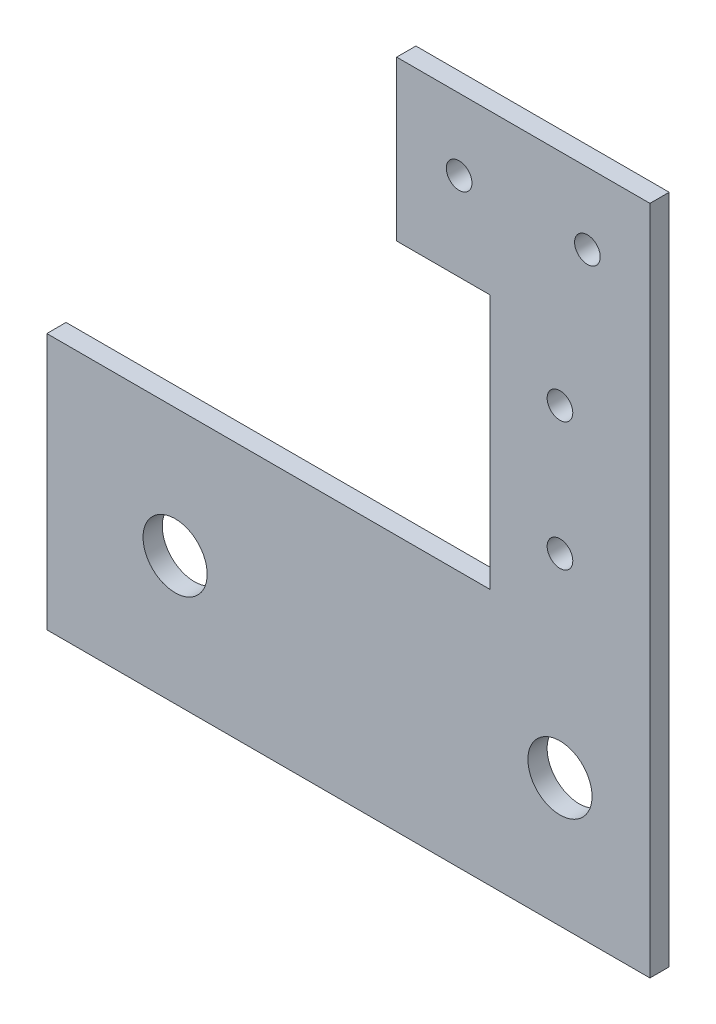
ISO-10303-21;
HEADER;
FILE_DESCRIPTION(('STEP AP214'),'2;1');
FILE_NAME('part.step','',(''),(''),'','','');
FILE_SCHEMA(('AUTOMOTIVE_DESIGN { 1 0 10303 214 1 1 1 1 }'));
ENDSEC;
DATA;
#1=APPLICATION_CONTEXT('core data for automotive mechanical design processes');
#2=APPLICATION_PROTOCOL_DEFINITION('international standard','automotive_design',2000,#1);
#3=PRODUCT_CONTEXT('',#1,'mechanical');
#4=PRODUCT('Part','Part','',(#3));
#5=PRODUCT_RELATED_PRODUCT_CATEGORY('part','',(#4));
#6=PRODUCT_DEFINITION_FORMATION('','',#4);
#7=PRODUCT_DEFINITION_CONTEXT('part definition',#1,'design');
#8=PRODUCT_DEFINITION('design','',#6,#7);
#9=PRODUCT_DEFINITION_SHAPE('','',#8);
#10=(LENGTH_UNIT() NAMED_UNIT(*) SI_UNIT(.MILLI.,.METRE.));
#11=(NAMED_UNIT(*) PLANE_ANGLE_UNIT() SI_UNIT($,.RADIAN.));
#12=(NAMED_UNIT(*) SI_UNIT($,.STERADIAN.) SOLID_ANGLE_UNIT());
#13=UNCERTAINTY_MEASURE_WITH_UNIT(LENGTH_MEASURE(1.E-05),#10,'distance_accuracy_value','');
#14=(GEOMETRIC_REPRESENTATION_CONTEXT(3) GLOBAL_UNCERTAINTY_ASSIGNED_CONTEXT((#13)) GLOBAL_UNIT_ASSIGNED_CONTEXT((#10,
#11,#12)) REPRESENTATION_CONTEXT('',''));
#15=CARTESIAN_POINT('',(0.,0.,0.));
#16=DIRECTION('',(0.,0.,1.));
#17=DIRECTION('',(1.,0.,0.));
#18=AXIS2_PLACEMENT_3D('',#15,#16,#17);
#19=CARTESIAN_POINT('',(-12.4753394630552,0.,1.5));
#20=DIRECTION('',(1.,0.,0.));
#21=DIRECTION('',(0.,0.,-1.));
#22=AXIS2_PLACEMENT_3D('',#19,#20,#21);
#23=PLANE('',#22);
#24=DIRECTION('',(0.,-1.,0.));
#25=VECTOR('',#24,1.);
#26=CARTESIAN_POINT('',(-12.4753394630552,0.,0.));
#27=LINE('',#26,#25);
#28=CARTESIAN_POINT('',(-12.4753394630552,19.6462038788269,0.));
#29=VERTEX_POINT('',#28);
#30=CARTESIAN_POINT('',(-12.4753394630552,-0.233517886677646,0.));
#31=VERTEX_POINT('',#30);
#32=EDGE_CURVE('E151',#29,#31,#27,.T.);
#33=ORIENTED_EDGE('',*,*,#32,.T.);
#34=DIRECTION('',(0.,0.,-1.));
#35=VECTOR('',#34,1.);
#36=CARTESIAN_POINT('',(-12.4753394630552,-0.233517886677646,1.5));
#37=LINE('',#36,#35);
#38=CARTESIAN_POINT('',(-12.4753394630552,-0.233517886677646,1.5));
#39=VERTEX_POINT('',#38);
#40=EDGE_CURVE('E11',#39,#31,#37,.T.);
#41=ORIENTED_EDGE('',*,*,#40,.F.);
#42=DIRECTION('',(0.,-1.,0.));
#43=VECTOR('',#42,1.);
#44=CARTESIAN_POINT('',(-12.4753394630552,0.,1.5));
#45=LINE('',#44,#43);
#46=CARTESIAN_POINT('',(-12.4753394630552,19.6462038788269,1.5));
#47=VERTEX_POINT('',#46);
#48=EDGE_CURVE('E195',#47,#39,#45,.T.);
#49=ORIENTED_EDGE('',*,*,#48,.F.);
#50=DIRECTION('',(0.,0.,-1.));
#51=VECTOR('',#50,1.);
#52=CARTESIAN_POINT('',(-12.4753394630552,19.6462038788269,1.5));
#53=LINE('',#52,#51);
#54=EDGE_CURVE('E129',#47,#29,#53,.T.);
#55=ORIENTED_EDGE('',*,*,#54,.T.);
#56=EDGE_LOOP('',(#33,#41,#49,#55));
#57=FACE_BOUND('',#56,.T.);
#58=ADVANCED_FACE('F36',(#57),#23,.F.);
#59=CARTESIAN_POINT('',(0.,-0.233517886677646,1.5));
#60=DIRECTION('',(0.,-1.,0.));
#61=DIRECTION('',(0.,0.,-1.));
#62=AXIS2_PLACEMENT_3D('',#59,#60,#61);
#63=PLANE('',#62);
#64=DIRECTION('',(-1.,0.,0.));
#65=VECTOR('',#64,1.);
#66=CARTESIAN_POINT('',(0.,-0.233517886677646,0.));
#67=LINE('',#66,#65);
#68=CARTESIAN_POINT('',(-47.0136947847413,-0.233517886677646,0.));
#69=VERTEX_POINT('',#68);
#70=EDGE_CURVE('E154',#31,#69,#67,.T.);
#71=ORIENTED_EDGE('',*,*,#70,.T.);
#72=DIRECTION('',(0.,0.,-1.));
#73=VECTOR('',#72,1.);
#74=CARTESIAN_POINT('',(-47.0136947847413,-0.233517886677646,1.5));
#75=LINE('',#74,#73);
#76=CARTESIAN_POINT('',(-47.0136947847413,-0.233517886677646,1.5));
#77=VERTEX_POINT('',#76);
#78=EDGE_CURVE('E45',#77,#69,#75,.T.);
#79=ORIENTED_EDGE('',*,*,#78,.F.);
#80=DIRECTION('',(-1.,0.,0.));
#81=VECTOR('',#80,1.);
#82=CARTESIAN_POINT('',(0.,-0.233517886677646,1.5));
#83=LINE('',#82,#81);
#84=EDGE_CURVE('E96',#39,#77,#83,.T.);
#85=ORIENTED_EDGE('',*,*,#84,.F.);
#86=ORIENTED_EDGE('',*,*,#40,.T.);
#87=EDGE_LOOP('',(#71,#79,#85,#86));
#88=FACE_BOUND('',#87,.T.);
#89=ADVANCED_FACE('F246',(#88),#63,.F.);
#90=CARTESIAN_POINT('',(-47.0136947847413,0.,1.5));
#91=DIRECTION('',(1.,0.,0.));
#92=DIRECTION('',(0.,1.,0.));
#93=AXIS2_PLACEMENT_3D('',#90,#91,#92);
#94=PLANE('',#93);
#95=DIRECTION('',(0.,-1.,0.));
#96=VECTOR('',#95,1.);
#97=CARTESIAN_POINT('',(-47.0136947847413,0.,0.));
#98=LINE('',#97,#96);
#99=CARTESIAN_POINT('',(-47.0136947847413,-20.2335178866776,0.));
#100=VERTEX_POINT('',#99);
#101=EDGE_CURVE('E156',#69,#100,#98,.T.);
#102=ORIENTED_EDGE('',*,*,#101,.T.);
#103=DIRECTION('',(0.,0.,-1.));
#104=VECTOR('',#103,1.);
#105=CARTESIAN_POINT('',(-47.0136947847413,-20.2335178866776,1.5));
#106=LINE('',#105,#104);
#107=CARTESIAN_POINT('',(-47.0136947847413,-20.2335178866776,1.5));
#108=VERTEX_POINT('',#107);
#109=EDGE_CURVE('E174',#108,#100,#106,.T.);
#110=ORIENTED_EDGE('',*,*,#109,.F.);
#111=DIRECTION('',(0.,-1.,0.));
#112=VECTOR('',#111,1.);
#113=CARTESIAN_POINT('',(-47.0136947847413,0.,1.5));
#114=LINE('',#113,#112);
#115=EDGE_CURVE('E181',#77,#108,#114,.T.);
#116=ORIENTED_EDGE('',*,*,#115,.F.);
#117=ORIENTED_EDGE('',*,*,#78,.T.);
#118=EDGE_LOOP('',(#102,#110,#116,#117));
#119=FACE_BOUND('',#118,.T.);
#120=ADVANCED_FACE('F179',(#119),#94,.F.);
#121=CARTESIAN_POINT('',(0.,-20.2335178866776,1.5));
#122=DIRECTION('',(0.,-1.,0.));
#123=DIRECTION('',(1.,0.,0.));
#124=AXIS2_PLACEMENT_3D('',#121,#122,#123);
#125=PLANE('',#124);
#126=DIRECTION('',(-1.,0.,0.));
#127=VECTOR('',#126,1.);
#128=CARTESIAN_POINT('',(0.,-20.2335178866776,0.));
#129=LINE('',#128,#127);
#130=CARTESIAN_POINT('',(0.,-20.2335178866776,0.));
#131=VERTEX_POINT('',#130);
#132=EDGE_CURVE('E159',#131,#100,#129,.T.);
#133=ORIENTED_EDGE('',*,*,#132,.F.);
#134=DIRECTION('',(0.,0.,-1.));
#135=VECTOR('',#134,1.);
#136=CARTESIAN_POINT('',(0.,-20.2335178866776,1.5));
#137=LINE('',#136,#135);
#138=CARTESIAN_POINT('',(0.,-20.2335178866776,1.5));
#139=VERTEX_POINT('',#138);
#140=EDGE_CURVE('E172',#139,#131,#137,.T.);
#141=ORIENTED_EDGE('',*,*,#140,.F.);
#142=DIRECTION('',(-1.,0.,0.));
#143=VECTOR('',#142,1.);
#144=CARTESIAN_POINT('',(0.,-20.2335178866776,1.5));
#145=LINE('',#144,#143);
#146=EDGE_CURVE('E190',#139,#108,#145,.T.);
#147=ORIENTED_EDGE('',*,*,#146,.T.);
#148=ORIENTED_EDGE('',*,*,#109,.T.);
#149=EDGE_LOOP('',(#133,#141,#147,#148));
#150=FACE_BOUND('',#149,.T.);
#151=ADVANCED_FACE('F188',(#150),#125,.T.);
#152=CARTESIAN_POINT('',(0.,0.,1.5));
#153=DIRECTION('',(1.,0.,0.));
#154=DIRECTION('',(0.,1.,0.));
#155=AXIS2_PLACEMENT_3D('',#152,#153,#154);
#156=PLANE('',#155);
#157=DIRECTION('',(0.,-1.,0.));
#158=VECTOR('',#157,1.);
#159=CARTESIAN_POINT('',(0.,0.,0.));
#160=LINE('',#159,#158);
#161=CARTESIAN_POINT('',(0.,32.0615509697022,0.));
#162=VERTEX_POINT('',#161);
#163=EDGE_CURVE('E162',#162,#131,#160,.T.);
#164=ORIENTED_EDGE('',*,*,#163,.F.);
#165=DIRECTION('',(0.,0.,-1.));
#166=VECTOR('',#165,1.);
#167=CARTESIAN_POINT('',(0.,32.0615509697022,1.5));
#168=LINE('',#167,#166);
#169=CARTESIAN_POINT('',(0.,32.0615509697022,1.5));
#170=VERTEX_POINT('',#169);
#171=EDGE_CURVE('E124',#170,#162,#168,.T.);
#172=ORIENTED_EDGE('',*,*,#171,.F.);
#173=DIRECTION('',(0.,-1.,0.));
#174=VECTOR('',#173,1.);
#175=CARTESIAN_POINT('',(0.,0.,1.5));
#176=LINE('',#175,#174);
#177=EDGE_CURVE('E117',#170,#139,#176,.T.);
#178=ORIENTED_EDGE('',*,*,#177,.T.);
#179=ORIENTED_EDGE('',*,*,#140,.T.);
#180=EDGE_LOOP('',(#164,#172,#178,#179));
#181=FACE_BOUND('',#180,.T.);
#182=ADVANCED_FACE('F292',(#181),#156,.T.);
#183=CARTESIAN_POINT('',(0.,32.0615509697022,1.5));
#184=DIRECTION('',(0.,-1.,0.));
#185=DIRECTION('',(0.,0.,-1.));
#186=AXIS2_PLACEMENT_3D('',#183,#184,#185);
#187=PLANE('',#186);
#188=DIRECTION('',(-1.,0.,0.));
#189=VECTOR('',#188,1.);
#190=CARTESIAN_POINT('',(0.,32.0615509697022,0.));
#191=LINE('',#190,#189);
#192=CARTESIAN_POINT('',(-19.7436947847421,32.0615509697022,0.));
#193=VERTEX_POINT('',#192);
#194=EDGE_CURVE('E123',#162,#193,#191,.T.);
#195=ORIENTED_EDGE('',*,*,#194,.T.);
#196=DIRECTION('',(0.,0.,-1.));
#197=VECTOR('',#196,1.);
#198=CARTESIAN_POINT('',(-19.7436947847421,32.0615509697022,1.5));
#199=LINE('',#198,#197);
#200=CARTESIAN_POINT('',(-19.7436947847421,32.0615509697022,1.5));
#201=VERTEX_POINT('',#200);
#202=EDGE_CURVE('E120',#201,#193,#199,.T.);
#203=ORIENTED_EDGE('',*,*,#202,.F.);
#204=DIRECTION('',(-1.,0.,0.));
#205=VECTOR('',#204,1.);
#206=CARTESIAN_POINT('',(0.,32.0615509697022,1.5));
#207=LINE('',#206,#205);
#208=EDGE_CURVE('E110',#170,#201,#207,.T.);
#209=ORIENTED_EDGE('',*,*,#208,.F.);
#210=ORIENTED_EDGE('',*,*,#171,.T.);
#211=EDGE_LOOP('',(#195,#203,#209,#210));
#212=FACE_BOUND('',#211,.T.);
#213=ADVANCED_FACE('F121',(#212),#187,.F.);
#214=CARTESIAN_POINT('',(-19.7436947847421,0.,1.5));
#215=DIRECTION('',(1.,0.,0.));
#216=DIRECTION('',(0.,0.,-1.));
#217=AXIS2_PLACEMENT_3D('',#214,#215,#216);
#218=PLANE('',#217);
#219=DIRECTION('',(0.,-1.,0.));
#220=VECTOR('',#219,1.);
#221=CARTESIAN_POINT('',(-19.7436947847421,0.,0.));
#222=LINE('',#221,#220);
#223=CARTESIAN_POINT('',(-19.7436947847421,19.6462038788269,0.));
#224=VERTEX_POINT('',#223);
#225=EDGE_CURVE('E82',#193,#224,#222,.T.);
#226=ORIENTED_EDGE('',*,*,#225,.T.);
#227=DIRECTION('',(0.,0.,-1.));
#228=VECTOR('',#227,1.);
#229=CARTESIAN_POINT('',(-19.7436947847421,19.6462038788269,1.5));
#230=LINE('',#229,#228);
#231=CARTESIAN_POINT('',(-19.7436947847421,19.6462038788269,1.5));
#232=VERTEX_POINT('',#231);
#233=EDGE_CURVE('E125',#232,#224,#230,.T.);
#234=ORIENTED_EDGE('',*,*,#233,.F.);
#235=DIRECTION('',(0.,-1.,0.));
#236=VECTOR('',#235,1.);
#237=CARTESIAN_POINT('',(-19.7436947847421,0.,1.5));
#238=LINE('',#237,#236);
#239=EDGE_CURVE('E114',#201,#232,#238,.T.);
#240=ORIENTED_EDGE('',*,*,#239,.F.);
#241=ORIENTED_EDGE('',*,*,#202,.T.);
#242=EDGE_LOOP('',(#226,#234,#240,#241));
#243=FACE_BOUND('',#242,.T.);
#244=ADVANCED_FACE('F127',(#243),#218,.F.);
#245=CARTESIAN_POINT('',(-14.8736947847421,26.5015509697056,1.5));
#246=DIRECTION('',(0.,0.,-1.));
#247=DIRECTION('',(-1.,0.,0.));
#248=AXIS2_PLACEMENT_3D('',#245,#246,#247);
#249=CYLINDRICAL_SURFACE('',#248,0.999999999999998);
#250=CARTESIAN_POINT('',(-14.8736947847421,26.5015509697056,1.5));
#251=DIRECTION('',(0.,0.,1.));
#252=DIRECTION('',(1.,0.,0.));
#253=AXIS2_PLACEMENT_3D('',#250,#251,#252);
#254=CIRCLE('',#253,0.999999999999998);
#255=CARTESIAN_POINT('',(-13.8736947847421,26.5015509697056,1.5));
#256=VERTEX_POINT('',#255);
#257=EDGE_CURVE('E197',#256,#256,#254,.T.);
#258=ORIENTED_EDGE('',*,*,#257,.T.);
#259=EDGE_LOOP('',(#258));
#260=FACE_BOUND('',#259,.T.);
#261=CARTESIAN_POINT('',(-14.8736947847421,26.5015509697056,0.));
#262=DIRECTION('',(0.,0.,1.));
#263=DIRECTION('',(1.,0.,0.));
#264=AXIS2_PLACEMENT_3D('',#261,#262,#263);
#265=CIRCLE('',#264,0.999999999999998);
#266=CARTESIAN_POINT('',(-13.8736947847421,26.5015509697056,0.));
#267=VERTEX_POINT('',#266);
#268=EDGE_CURVE('E148',#267,#267,#265,.T.);
#269=ORIENTED_EDGE('',*,*,#268,.F.);
#270=EDGE_LOOP('',(#269));
#271=FACE_BOUND('',#270,.T.);
#272=ADVANCED_FACE('F231',(#260,#271),#249,.F.);
#273=CARTESIAN_POINT('',(-4.87369478474205,26.5015509697056,1.5));
#274=DIRECTION('',(0.,0.,-1.));
#275=DIRECTION('',(-1.,0.,0.));
#276=AXIS2_PLACEMENT_3D('',#273,#274,#275);
#277=CYLINDRICAL_SURFACE('',#276,1.00000000000001);
#278=CARTESIAN_POINT('',(-4.87369478474205,26.5015509697056,1.5));
#279=DIRECTION('',(0.,0.,1.));
#280=DIRECTION('',(1.,0.,0.));
#281=AXIS2_PLACEMENT_3D('',#278,#279,#280);
#282=CIRCLE('',#281,1.00000000000001);
#283=CARTESIAN_POINT('',(-3.87369478474204,26.5015509697056,1.5));
#284=VERTEX_POINT('',#283);
#285=EDGE_CURVE('E200',#284,#284,#282,.T.);
#286=ORIENTED_EDGE('',*,*,#285,.T.);
#287=EDGE_LOOP('',(#286));
#288=FACE_BOUND('',#287,.T.);
#289=CARTESIAN_POINT('',(-4.87369478474205,26.5015509697056,0.));
#290=DIRECTION('',(0.,0.,1.));
#291=DIRECTION('',(1.,0.,0.));
#292=AXIS2_PLACEMENT_3D('',#289,#290,#291);
#293=CIRCLE('',#292,1.00000000000001);
#294=CARTESIAN_POINT('',(-3.87369478474204,26.5015509697056,0.));
#295=VERTEX_POINT('',#294);
#296=EDGE_CURVE('E145',#295,#295,#293,.T.);
#297=ORIENTED_EDGE('',*,*,#296,.F.);
#298=EDGE_LOOP('',(#297));
#299=FACE_BOUND('',#298,.T.);
#300=ADVANCED_FACE('F234',(#288,#299),#277,.F.);
#301=CARTESIAN_POINT('',(-7.01369478474131,14.9115509697067,1.5));
#302=DIRECTION('',(0.,0.,-1.));
#303=DIRECTION('',(-1.,0.,0.));
#304=AXIS2_PLACEMENT_3D('',#301,#302,#303);
#305=CYLINDRICAL_SURFACE('',#304,0.999999999999998);
#306=CARTESIAN_POINT('',(-7.01369478474131,14.9115509697067,1.5));
#307=DIRECTION('',(0.,0.,1.));
#308=DIRECTION('',(1.,0.,0.));
#309=AXIS2_PLACEMENT_3D('',#306,#307,#308);
#310=CIRCLE('',#309,0.999999999999998);
#311=CARTESIAN_POINT('',(-6.01369478474131,14.9115509697067,1.5));
#312=VERTEX_POINT('',#311);
#313=EDGE_CURVE('E203',#312,#312,#310,.T.);
#314=ORIENTED_EDGE('',*,*,#313,.T.);
#315=EDGE_LOOP('',(#314));
#316=FACE_BOUND('',#315,.T.);
#317=CARTESIAN_POINT('',(-7.01369478474131,14.9115509697067,0.));
#318=DIRECTION('',(0.,0.,1.));
#319=DIRECTION('',(1.,0.,0.));
#320=AXIS2_PLACEMENT_3D('',#317,#318,#319);
#321=CIRCLE('',#320,0.999999999999998);
#322=CARTESIAN_POINT('',(-6.01369478474131,14.9115509697067,0.));
#323=VERTEX_POINT('',#322);
#324=EDGE_CURVE('E142',#323,#323,#321,.T.);
#325=ORIENTED_EDGE('',*,*,#324,.F.);
#326=EDGE_LOOP('',(#325));
#327=FACE_BOUND('',#326,.T.);
#328=ADVANCED_FACE('F257',(#316,#327),#305,.F.);
#329=CARTESIAN_POINT('',(-7.01369478474131,4.91155096970669,1.5));
#330=DIRECTION('',(0.,0.,-1.));
#331=DIRECTION('',(-1.,0.,0.));
#332=AXIS2_PLACEMENT_3D('',#329,#330,#331);
#333=CYLINDRICAL_SURFACE('',#332,0.999999999999998);
#334=CARTESIAN_POINT('',(-7.01369478474131,4.91155096970669,1.5));
#335=DIRECTION('',(0.,0.,1.));
#336=DIRECTION('',(1.,0.,0.));
#337=AXIS2_PLACEMENT_3D('',#334,#335,#336);
#338=CIRCLE('',#337,0.999999999999998);
#339=CARTESIAN_POINT('',(-6.01369478474131,4.91155096970669,1.5));
#340=VERTEX_POINT('',#339);
#341=EDGE_CURVE('E206',#340,#340,#338,.T.);
#342=ORIENTED_EDGE('',*,*,#341,.T.);
#343=EDGE_LOOP('',(#342));
#344=FACE_BOUND('',#343,.T.);
#345=CARTESIAN_POINT('',(-7.01369478474131,4.91155096970669,0.));
#346=DIRECTION('',(0.,0.,1.));
#347=DIRECTION('',(1.,0.,0.));
#348=AXIS2_PLACEMENT_3D('',#345,#346,#347);
#349=CIRCLE('',#348,0.999999999999998);
#350=CARTESIAN_POINT('',(-6.01369478474131,4.91155096970669,0.));
#351=VERTEX_POINT('',#350);
#352=EDGE_CURVE('E139',#351,#351,#349,.T.);
#353=ORIENTED_EDGE('',*,*,#352,.F.);
#354=EDGE_LOOP('',(#353));
#355=FACE_BOUND('',#354,.T.);
#356=ADVANCED_FACE('F261',(#344,#355),#333,.F.);
#357=CARTESIAN_POINT('',(-7.0136947847413,-10.2335178866776,1.5));
#358=DIRECTION('',(0.,0.,-1.));
#359=DIRECTION('',(-1.,0.,0.));
#360=AXIS2_PLACEMENT_3D('',#357,#358,#359);
#361=CYLINDRICAL_SURFACE('',#360,2.5);
#362=CARTESIAN_POINT('',(-7.0136947847413,-10.2335178866776,1.5));
#363=DIRECTION('',(0.,0.,1.));
#364=DIRECTION('',(1.,0.,0.));
#365=AXIS2_PLACEMENT_3D('',#362,#363,#364);
#366=CIRCLE('',#365,2.5);
#367=CARTESIAN_POINT('',(-4.5136947847413,-10.2335178866776,1.5));
#368=VERTEX_POINT('',#367);
#369=EDGE_CURVE('E209',#368,#368,#366,.T.);
#370=ORIENTED_EDGE('',*,*,#369,.T.);
#371=EDGE_LOOP('',(#370));
#372=FACE_BOUND('',#371,.T.);
#373=CARTESIAN_POINT('',(-7.0136947847413,-10.2335178866776,0.));
#374=DIRECTION('',(0.,0.,1.));
#375=DIRECTION('',(1.,0.,0.));
#376=AXIS2_PLACEMENT_3D('',#373,#374,#375);
#377=CIRCLE('',#376,2.5);
#378=CARTESIAN_POINT('',(-4.5136947847413,-10.2335178866776,0.));
#379=VERTEX_POINT('',#378);
#380=EDGE_CURVE('E136',#379,#379,#377,.T.);
#381=ORIENTED_EDGE('',*,*,#380,.F.);
#382=EDGE_LOOP('',(#381));
#383=FACE_BOUND('',#382,.T.);
#384=ADVANCED_FACE('F264',(#372,#383),#361,.F.);
#385=CARTESIAN_POINT('',(-37.0136947847413,-10.2335178866776,1.5));
#386=DIRECTION('',(0.,0.,-1.));
#387=DIRECTION('',(-1.,0.,0.));
#388=AXIS2_PLACEMENT_3D('',#385,#386,#387);
#389=CYLINDRICAL_SURFACE('',#388,2.5);
#390=CARTESIAN_POINT('',(-37.0136947847413,-10.2335178866776,1.5));
#391=DIRECTION('',(0.,0.,1.));
#392=DIRECTION('',(1.,0.,0.));
#393=AXIS2_PLACEMENT_3D('',#390,#391,#392);
#394=CIRCLE('',#393,2.5);
#395=CARTESIAN_POINT('',(-34.5136947847413,-10.2335178866776,1.5));
#396=VERTEX_POINT('',#395);
#397=EDGE_CURVE('E168',#396,#396,#394,.T.);
#398=ORIENTED_EDGE('',*,*,#397,.T.);
#399=EDGE_LOOP('',(#398));
#400=FACE_BOUND('',#399,.T.);
#401=CARTESIAN_POINT('',(-37.0136947847413,-10.2335178866776,0.));
#402=DIRECTION('',(0.,0.,1.));
#403=DIRECTION('',(1.,0.,0.));
#404=AXIS2_PLACEMENT_3D('',#401,#402,#403);
#405=CIRCLE('',#404,2.5);
#406=CARTESIAN_POINT('',(-34.5136947847413,-10.2335178866776,0.));
#407=VERTEX_POINT('',#406);
#408=EDGE_CURVE('E133',#407,#407,#405,.T.);
#409=ORIENTED_EDGE('',*,*,#408,.F.);
#410=EDGE_LOOP('',(#409));
#411=FACE_BOUND('',#410,.T.);
#412=ADVANCED_FACE('F38',(#400,#411),#389,.F.);
#413=CARTESIAN_POINT('',(0.,19.6462038788269,1.5));
#414=DIRECTION('',(0.,1.,0.));
#415=DIRECTION('',(0.,0.,1.));
#416=AXIS2_PLACEMENT_3D('',#413,#414,#415);
#417=PLANE('',#416);
#418=DIRECTION('',(1.,0.,0.));
#419=VECTOR('',#418,1.);
#420=CARTESIAN_POINT('',(0.,19.6462038788269,0.));
#421=LINE('',#420,#419);
#422=EDGE_CURVE('E88',#224,#29,#421,.T.);
#423=ORIENTED_EDGE('',*,*,#422,.T.);
#424=ORIENTED_EDGE('',*,*,#54,.F.);
#425=DIRECTION('',(1.,0.,0.));
#426=VECTOR('',#425,1.);
#427=CARTESIAN_POINT('',(0.,19.6462038788269,1.5));
#428=LINE('',#427,#426);
#429=EDGE_CURVE('E53',#232,#47,#428,.T.);
#430=ORIENTED_EDGE('',*,*,#429,.F.);
#431=ORIENTED_EDGE('',*,*,#233,.T.);
#432=EDGE_LOOP('',(#423,#424,#430,#431));
#433=FACE_BOUND('',#432,.T.);
#434=ADVANCED_FACE('F219',(#433),#417,.F.);
#435=CARTESIAN_POINT('',(0.,0.,1.5));
#436=DIRECTION('',(0.,0.,1.));
#437=DIRECTION('',(1.,0.,0.));
#438=AXIS2_PLACEMENT_3D('',#435,#436,#437);
#439=PLANE('',#438);
#440=ORIENTED_EDGE('',*,*,#397,.F.);
#441=EDGE_LOOP('',(#440));
#442=FACE_BOUND('',#441,.T.);
#443=ORIENTED_EDGE('',*,*,#369,.F.);
#444=EDGE_LOOP('',(#443));
#445=FACE_BOUND('',#444,.T.);
#446=ORIENTED_EDGE('',*,*,#341,.F.);
#447=EDGE_LOOP('',(#446));
#448=FACE_BOUND('',#447,.T.);
#449=ORIENTED_EDGE('',*,*,#313,.F.);
#450=EDGE_LOOP('',(#449));
#451=FACE_BOUND('',#450,.T.);
#452=ORIENTED_EDGE('',*,*,#285,.F.);
#453=EDGE_LOOP('',(#452));
#454=FACE_BOUND('',#453,.T.);
#455=ORIENTED_EDGE('',*,*,#257,.F.);
#456=EDGE_LOOP('',(#455));
#457=FACE_BOUND('',#456,.T.);
#458=ORIENTED_EDGE('',*,*,#48,.T.);
#459=ORIENTED_EDGE('',*,*,#84,.T.);
#460=ORIENTED_EDGE('',*,*,#115,.T.);
#461=ORIENTED_EDGE('',*,*,#146,.F.);
#462=ORIENTED_EDGE('',*,*,#177,.F.);
#463=ORIENTED_EDGE('',*,*,#208,.T.);
#464=ORIENTED_EDGE('',*,*,#239,.T.);
#465=ORIENTED_EDGE('',*,*,#429,.T.);
#466=EDGE_LOOP('',(#458,#459,#460,#461,#462,#463,#464,#465));
#467=FACE_BOUND('',#466,.T.);
#468=ADVANCED_FACE('F112',(#442,#445,#448,#451,#454,#457,#467),#439,.T.);
#469=CARTESIAN_POINT('',(0.,0.,0.));
#470=DIRECTION('',(0.,0.,1.));
#471=DIRECTION('',(1.,0.,0.));
#472=AXIS2_PLACEMENT_3D('',#469,#470,#471);
#473=PLANE('',#472);
#474=ORIENTED_EDGE('',*,*,#408,.T.);
#475=EDGE_LOOP('',(#474));
#476=FACE_BOUND('',#475,.T.);
#477=ORIENTED_EDGE('',*,*,#380,.T.);
#478=EDGE_LOOP('',(#477));
#479=FACE_BOUND('',#478,.T.);
#480=ORIENTED_EDGE('',*,*,#352,.T.);
#481=EDGE_LOOP('',(#480));
#482=FACE_BOUND('',#481,.T.);
#483=ORIENTED_EDGE('',*,*,#324,.T.);
#484=EDGE_LOOP('',(#483));
#485=FACE_BOUND('',#484,.T.);
#486=ORIENTED_EDGE('',*,*,#296,.T.);
#487=EDGE_LOOP('',(#486));
#488=FACE_BOUND('',#487,.T.);
#489=ORIENTED_EDGE('',*,*,#268,.T.);
#490=EDGE_LOOP('',(#489));
#491=FACE_BOUND('',#490,.T.);
#492=ORIENTED_EDGE('',*,*,#32,.F.);
#493=ORIENTED_EDGE('',*,*,#422,.F.);
#494=ORIENTED_EDGE('',*,*,#225,.F.);
#495=ORIENTED_EDGE('',*,*,#194,.F.);
#496=ORIENTED_EDGE('',*,*,#163,.T.);
#497=ORIENTED_EDGE('',*,*,#132,.T.);
#498=ORIENTED_EDGE('',*,*,#101,.F.);
#499=ORIENTED_EDGE('',*,*,#70,.F.);
#500=EDGE_LOOP('',(#492,#493,#494,#495,#496,#497,#498,#499));
#501=FACE_BOUND('',#500,.T.);
#502=ADVANCED_FACE('F184',(#476,#479,#482,#485,#488,#491,#501),#473,.F.);
#503=CLOSED_SHELL('',(#58,#89,#120,#151,#182,#213,#244,#272,#300,#328,#356,#384,#412,#434,#468,#502));
#504=MANIFOLD_SOLID_BREP('B2',#503);
#505=ADVANCED_BREP_SHAPE_REPRESENTATION('',(#18,#504),#14);
#506=SHAPE_DEFINITION_REPRESENTATION(#9,#505);
ENDSEC;
END-ISO-10303-21;
